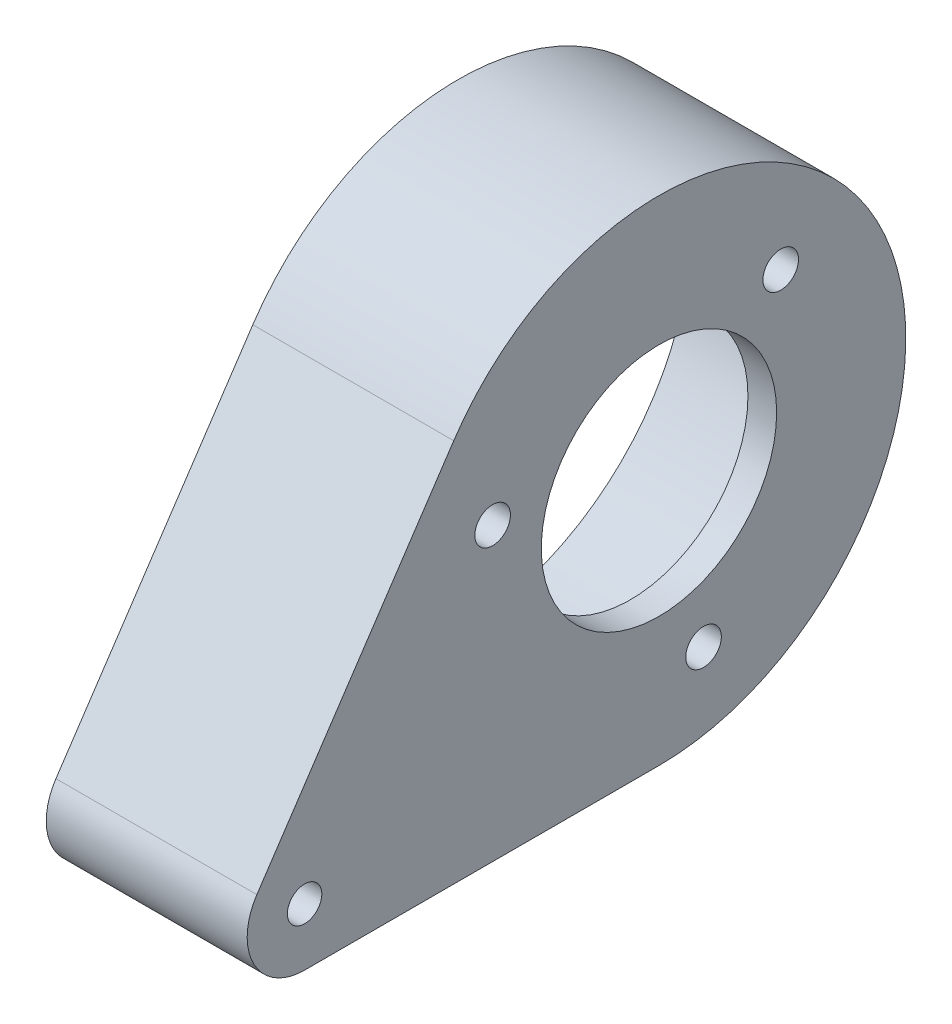
ISO-10303-21;
HEADER;
FILE_DESCRIPTION(('STEP AP214'),'2;1');
FILE_NAME('part.step','',(''),(''),'','','');
FILE_SCHEMA(('AUTOMOTIVE_DESIGN { 1 0 10303 214 1 1 1 1 }'));
ENDSEC;
DATA;
#1=APPLICATION_CONTEXT('core data for automotive mechanical design processes');
#2=APPLICATION_PROTOCOL_DEFINITION('international standard','automotive_design',2000,#1);
#3=PRODUCT_CONTEXT('',#1,'mechanical');
#4=PRODUCT('Part','Part','',(#3));
#5=PRODUCT_RELATED_PRODUCT_CATEGORY('part','',(#4));
#6=PRODUCT_DEFINITION_FORMATION('','',#4);
#7=PRODUCT_DEFINITION_CONTEXT('part definition',#1,'design');
#8=PRODUCT_DEFINITION('design','',#6,#7);
#9=PRODUCT_DEFINITION_SHAPE('','',#8);
#10=(LENGTH_UNIT() NAMED_UNIT(*) SI_UNIT(.MILLI.,.METRE.));
#11=(NAMED_UNIT(*) PLANE_ANGLE_UNIT() SI_UNIT($,.RADIAN.));
#12=(NAMED_UNIT(*) SI_UNIT($,.STERADIAN.) SOLID_ANGLE_UNIT());
#13=UNCERTAINTY_MEASURE_WITH_UNIT(LENGTH_MEASURE(1.E-05),#10,'distance_accuracy_value','');
#14=(GEOMETRIC_REPRESENTATION_CONTEXT(3) GLOBAL_UNCERTAINTY_ASSIGNED_CONTEXT((#13)) GLOBAL_UNIT_ASSIGNED_CONTEXT((#10,
#11,#12)) REPRESENTATION_CONTEXT('',''));
#15=CARTESIAN_POINT('',(0.,0.,0.));
#16=DIRECTION('',(0.,0.,1.));
#17=DIRECTION('',(1.,0.,0.));
#18=AXIS2_PLACEMENT_3D('',#15,#16,#17);
#19=CARTESIAN_POINT('',(2.5,-16.5,30.8666486681013));
#20=DIRECTION('',(-1.,0.,0.));
#21=DIRECTION('',(0.,0.,1.));
#22=AXIS2_PLACEMENT_3D('',#19,#20,#21);
#23=CYLINDRICAL_SURFACE('',#22,5.);
#24=DIRECTION('',(-1.,0.,0.));
#25=VECTOR('',#24,1.);
#26=CARTESIAN_POINT('',(2.5,-13.7224489795918,35.0241972642129));
#27=LINE('',#26,#25);
#28=CARTESIAN_POINT('',(2.5,-13.7224489795918,35.0241972642129));
#29=VERTEX_POINT('',#28);
#30=CARTESIAN_POINT('',(-15.,-13.7224489795918,35.0241972642129));
#31=VERTEX_POINT('',#30);
#32=EDGE_CURVE('E189',#29,#31,#27,.T.);
#33=ORIENTED_EDGE('',*,*,#32,.T.);
#34=CARTESIAN_POINT('',(-15.,-16.5,30.8666486681013));
#35=DIRECTION('',(-1.,0.,0.));
#36=DIRECTION('',(0.,0.,1.));
#37=AXIS2_PLACEMENT_3D('',#34,#35,#36);
#38=CIRCLE('',#37,5.);
#39=CARTESIAN_POINT('',(-15.,-21.5,30.8666486681013));
#40=VERTEX_POINT('',#39);
#41=EDGE_CURVE('E176',#40,#31,#38,.T.);
#42=ORIENTED_EDGE('',*,*,#41,.F.);
#43=DIRECTION('',(-1.,0.,0.));
#44=VECTOR('',#43,1.);
#45=CARTESIAN_POINT('',(2.5,-21.5,30.8666486681013));
#46=LINE('',#45,#44);
#47=CARTESIAN_POINT('',(2.5,-21.5,30.8666486681013));
#48=VERTEX_POINT('',#47);
#49=EDGE_CURVE('E47',#48,#40,#46,.T.);
#50=ORIENTED_EDGE('',*,*,#49,.F.);
#51=CARTESIAN_POINT('',(2.5,-16.5,30.8666486681013));
#52=DIRECTION('',(1.,0.,0.));
#53=DIRECTION('',(0.,0.,-1.));
#54=AXIS2_PLACEMENT_3D('',#51,#52,#53);
#55=CIRCLE('',#54,5.);
#56=EDGE_CURVE('E182',#29,#48,#55,.T.);
#57=ORIENTED_EDGE('',*,*,#56,.F.);
#58=EDGE_LOOP('',(#33,#42,#50,#57));
#59=FACE_BOUND('',#58,.T.);
#60=ADVANCED_FACE('F40',(#59),#23,.T.);
#61=CARTESIAN_POINT('',(2.5,-21.5,30.8666486681013));
#62=DIRECTION('',(0.,1.,0.));
#63=DIRECTION('',(0.,0.,1.));
#64=AXIS2_PLACEMENT_3D('',#61,#62,#63);
#65=PLANE('',#64);
#66=ORIENTED_EDGE('',*,*,#49,.T.);
#67=DIRECTION('',(0.,0.,1.));
#68=VECTOR('',#67,1.);
#69=CARTESIAN_POINT('',(-15.,-21.5,0.));
#70=LINE('',#69,#68);
#71=CARTESIAN_POINT('',(-15.,-21.5,0.));
#72=VERTEX_POINT('',#71);
#73=EDGE_CURVE('E173',#72,#40,#70,.T.);
#74=ORIENTED_EDGE('',*,*,#73,.F.);
#75=DIRECTION('',(-1.,0.,0.));
#76=VECTOR('',#75,1.);
#77=CARTESIAN_POINT('',(2.5,-21.5,0.));
#78=LINE('',#77,#76);
#79=CARTESIAN_POINT('',(2.5,-21.5,0.));
#80=VERTEX_POINT('',#79);
#81=EDGE_CURVE('E193',#80,#72,#78,.T.);
#82=ORIENTED_EDGE('',*,*,#81,.F.);
#83=DIRECTION('',(0.,0.,-1.));
#84=VECTOR('',#83,1.);
#85=CARTESIAN_POINT('',(2.5,-21.5,30.8666486681013));
#86=LINE('',#85,#84);
#87=EDGE_CURVE('E184',#48,#80,#86,.T.);
#88=ORIENTED_EDGE('',*,*,#87,.F.);
#89=EDGE_LOOP('',(#66,#74,#82,#88));
#90=FACE_BOUND('',#89,.T.);
#91=ADVANCED_FACE('F197',(#90),#65,.F.);
#92=CARTESIAN_POINT('',(2.5,0.,0.));
#93=DIRECTION('',(-1.,0.,0.));
#94=DIRECTION('',(0.,0.,1.));
#95=AXIS2_PLACEMENT_3D('',#92,#93,#94);
#96=CYLINDRICAL_SURFACE('',#95,21.5);
#97=ORIENTED_EDGE('',*,*,#81,.T.);
#98=CARTESIAN_POINT('',(-15.,0.,0.));
#99=DIRECTION('',(-1.,0.,0.));
#100=DIRECTION('',(0.,0.,1.));
#101=AXIS2_PLACEMENT_3D('',#98,#99,#100);
#102=CIRCLE('',#101,21.5);
#103=CARTESIAN_POINT('',(-15.,11.9434693877551,17.8774589632799));
#104=VERTEX_POINT('',#103);
#105=EDGE_CURVE('E168',#104,#72,#102,.T.);
#106=ORIENTED_EDGE('',*,*,#105,.F.);
#107=DIRECTION('',(-1.,0.,0.));
#108=VECTOR('',#107,1.);
#109=CARTESIAN_POINT('',(2.5,11.9434693877551,17.8774589632799));
#110=LINE('',#109,#108);
#111=CARTESIAN_POINT('',(2.5,11.9434693877551,17.8774589632799));
#112=VERTEX_POINT('',#111);
#113=EDGE_CURVE('E191',#112,#104,#110,.T.);
#114=ORIENTED_EDGE('',*,*,#113,.F.);
#115=CARTESIAN_POINT('',(2.5,0.,0.));
#116=DIRECTION('',(1.,0.,0.));
#117=DIRECTION('',(0.,0.,-1.));
#118=AXIS2_PLACEMENT_3D('',#115,#116,#117);
#119=CIRCLE('',#118,21.5);
#120=EDGE_CURVE('E186',#80,#112,#119,.T.);
#121=ORIENTED_EDGE('',*,*,#120,.F.);
#122=EDGE_LOOP('',(#97,#106,#114,#121));
#123=FACE_BOUND('',#122,.T.);
#124=ADVANCED_FACE('F210',(#123),#96,.T.);
#125=CARTESIAN_POINT('',(2.5,-13.7224489795918,35.0241972642129));
#126=DIRECTION('',(0.,-0.555510204081633,-0.831509719222321));
#127=DIRECTION('',(0.,0.831509719222321,-0.555510204081633));
#128=AXIS2_PLACEMENT_3D('',#125,#126,#127);
#129=PLANE('',#128);
#130=ORIENTED_EDGE('',*,*,#113,.T.);
#131=DIRECTION('',(0.,0.831509719222321,-0.555510204081633));
#132=VECTOR('',#131,1.);
#133=CARTESIAN_POINT('',(-15.,11.9434693877551,17.8774589632799));
#134=LINE('',#133,#132);
#135=EDGE_CURVE('E179',#31,#104,#134,.T.);
#136=ORIENTED_EDGE('',*,*,#135,.F.);
#137=ORIENTED_EDGE('',*,*,#32,.F.);
#138=DIRECTION('',(0.,-0.831509719222321,0.555510204081633));
#139=VECTOR('',#138,1.);
#140=CARTESIAN_POINT('',(2.5,-13.7224489795918,35.0241972642129));
#141=LINE('',#140,#139);
#142=EDGE_CURVE('E61',#112,#29,#141,.T.);
#143=ORIENTED_EDGE('',*,*,#142,.F.);
#144=EDGE_LOOP('',(#130,#136,#137,#143));
#145=FACE_BOUND('',#144,.T.);
#146=ADVANCED_FACE('F207',(#145),#129,.F.);
#147=CARTESIAN_POINT('',(2.5,-16.5,30.8666486681013));
#148=DIRECTION('',(1.,0.,0.));
#149=DIRECTION('',(0.,0.,-1.));
#150=AXIS2_PLACEMENT_3D('',#147,#148,#149);
#151=PLANE('',#150);
#152=CARTESIAN_POINT('',(2.5,-16.5,30.8666486681013));
#153=DIRECTION('',(-1.,0.,0.));
#154=DIRECTION('',(0.,0.,1.));
#155=AXIS2_PLACEMENT_3D('',#152,#153,#154);
#156=CIRCLE('',#155,1.50000000000001);
#157=CARTESIAN_POINT('',(2.5,-16.5,32.3666486681013));
#158=VERTEX_POINT('',#157);
#159=EDGE_CURVE('E137',#158,#158,#156,.T.);
#160=ORIENTED_EDGE('',*,*,#159,.T.);
#161=EDGE_LOOP('',(#160));
#162=FACE_BOUND('',#161,.T.);
#163=CARTESIAN_POINT('',(2.5,3.88228567653788,14.488887394336));
#164=DIRECTION('',(1.,0.,0.));
#165=DIRECTION('',(0.,0.,-1.));
#166=AXIS2_PLACEMENT_3D('',#163,#164,#165);
#167=CIRCLE('',#166,1.55);
#168=CARTESIAN_POINT('',(2.5,3.88228567653788,12.938887394336));
#169=VERTEX_POINT('',#168);
#170=EDGE_CURVE('E140',#169,#169,#167,.T.);
#171=ORIENTED_EDGE('',*,*,#170,.F.);
#172=EDGE_LOOP('',(#171));
#173=FACE_BOUND('',#172,.T.);
#174=CARTESIAN_POINT('',(2.5,-14.488887394336,-3.88228567653773));
#175=DIRECTION('',(1.,0.,0.));
#176=DIRECTION('',(0.,0.,-1.));
#177=AXIS2_PLACEMENT_3D('',#174,#175,#176);
#178=CIRCLE('',#177,1.55);
#179=CARTESIAN_POINT('',(2.5,-14.488887394336,-5.43228567653774));
#180=VERTEX_POINT('',#179);
#181=EDGE_CURVE('E148',#180,#180,#178,.T.);
#182=ORIENTED_EDGE('',*,*,#181,.F.);
#183=EDGE_LOOP('',(#182));
#184=FACE_BOUND('',#183,.T.);
#185=CARTESIAN_POINT('',(2.5,0.,0.));
#186=DIRECTION('',(1.,0.,0.));
#187=DIRECTION('',(0.,0.,-1.));
#188=AXIS2_PLACEMENT_3D('',#185,#186,#187);
#189=CIRCLE('',#188,10.25);
#190=CARTESIAN_POINT('',(2.5,0.,-10.25));
#191=VERTEX_POINT('',#190);
#192=EDGE_CURVE('E154',#191,#191,#189,.T.);
#193=ORIENTED_EDGE('',*,*,#192,.F.);
#194=EDGE_LOOP('',(#193));
#195=FACE_BOUND('',#194,.T.);
#196=CARTESIAN_POINT('',(2.5,10.6066017177982,-10.6066017177983));
#197=DIRECTION('',(1.,0.,0.));
#198=DIRECTION('',(0.,0.,-1.));
#199=AXIS2_PLACEMENT_3D('',#196,#197,#198);
#200=CIRCLE('',#199,1.55);
#201=CARTESIAN_POINT('',(2.5,10.6066017177982,-12.1566017177983));
#202=VERTEX_POINT('',#201);
#203=EDGE_CURVE('E160',#202,#202,#200,.T.);
#204=ORIENTED_EDGE('',*,*,#203,.F.);
#205=EDGE_LOOP('',(#204));
#206=FACE_BOUND('',#205,.T.);
#207=ORIENTED_EDGE('',*,*,#56,.T.);
#208=ORIENTED_EDGE('',*,*,#87,.T.);
#209=ORIENTED_EDGE('',*,*,#120,.T.);
#210=ORIENTED_EDGE('',*,*,#142,.T.);
#211=EDGE_LOOP('',(#207,#208,#209,#210));
#212=FACE_BOUND('',#211,.T.);
#213=ADVANCED_FACE('F212',(#162,#173,#184,#195,#206,#212),#151,.T.);
#214=CARTESIAN_POINT('',(-15.,0.,0.));
#215=DIRECTION('',(-1.,0.,0.));
#216=DIRECTION('',(0.,0.,1.));
#217=AXIS2_PLACEMENT_3D('',#214,#215,#216);
#218=PLANE('',#217);
#219=DIRECTION('',(0.,0.,-1.));
#220=VECTOR('',#219,1.);
#221=CARTESIAN_POINT('',(-15.,4.5,20.25));
#222=LINE('',#221,#220);
#223=CARTESIAN_POINT('',(-15.,4.5,21.25));
#224=VERTEX_POINT('',#223);
#225=CARTESIAN_POINT('',(-15.,4.5,19.7436698716323));
#226=VERTEX_POINT('',#225);
#227=EDGE_CURVE('E110',#224,#226,#222,.T.);
#228=ORIENTED_EDGE('',*,*,#227,.F.);
#229=DIRECTION('',(0.,1.,0.));
#230=VECTOR('',#229,1.);
#231=CARTESIAN_POINT('',(-15.,4.5,21.25));
#232=LINE('',#231,#230);
#233=CARTESIAN_POINT('',(-15.,-4.5,21.25));
#234=VERTEX_POINT('',#233);
#235=EDGE_CURVE('E292',#234,#224,#232,.T.);
#236=ORIENTED_EDGE('',*,*,#235,.F.);
#237=DIRECTION('',(0.,0.,1.));
#238=VECTOR('',#237,1.);
#239=CARTESIAN_POINT('',(-15.,-4.5,21.25));
#240=LINE('',#239,#238);
#241=CARTESIAN_POINT('',(-15.,-4.5,19.7436698716323));
#242=VERTEX_POINT('',#241);
#243=EDGE_CURVE('E122',#242,#234,#240,.T.);
#244=ORIENTED_EDGE('',*,*,#243,.F.);
#245=CARTESIAN_POINT('',(-15.,0.,0.));
#246=DIRECTION('',(-1.,0.,0.));
#247=DIRECTION('',(0.,0.,1.));
#248=AXIS2_PLACEMENT_3D('',#245,#246,#247);
#249=CIRCLE('',#248,20.25);
#250=EDGE_CURVE('E126',#226,#242,#249,.T.);
#251=ORIENTED_EDGE('',*,*,#250,.F.);
#252=EDGE_LOOP('',(#228,#236,#244,#251));
#253=FACE_BOUND('',#252,.T.);
#254=CARTESIAN_POINT('',(-15.,-16.5,30.8666486681013));
#255=DIRECTION('',(-1.,0.,0.));
#256=DIRECTION('',(0.,0.,1.));
#257=AXIS2_PLACEMENT_3D('',#254,#255,#256);
#258=CIRCLE('',#257,1.50000000000001);
#259=CARTESIAN_POINT('',(-15.,-16.5,32.3666486681013));
#260=VERTEX_POINT('',#259);
#261=EDGE_CURVE('E136',#260,#260,#258,.T.);
#262=ORIENTED_EDGE('',*,*,#261,.F.);
#263=EDGE_LOOP('',(#262));
#264=FACE_BOUND('',#263,.T.);
#265=ORIENTED_EDGE('',*,*,#105,.T.);
#266=ORIENTED_EDGE('',*,*,#73,.T.);
#267=ORIENTED_EDGE('',*,*,#41,.T.);
#268=ORIENTED_EDGE('',*,*,#135,.T.);
#269=EDGE_LOOP('',(#265,#266,#267,#268));
#270=FACE_BOUND('',#269,.T.);
#271=ADVANCED_FACE('F203',(#253,#264,#270),#218,.T.);
#272=CARTESIAN_POINT('',(-15.,0.,0.));
#273=DIRECTION('',(1.,0.,0.));
#274=DIRECTION('',(0.,0.,-1.));
#275=AXIS2_PLACEMENT_3D('',#272,#273,#274);
#276=CYLINDRICAL_SURFACE('',#275,20.25);
#277=DIRECTION('',(-1.,0.,0.));
#278=VECTOR('',#277,1.);
#279=CARTESIAN_POINT('',(9.12518659840052,4.5,19.7436698716323));
#280=LINE('',#279,#278);
#281=CARTESIAN_POINT('',(-4.,4.5,19.7436698716323));
#282=VERTEX_POINT('',#281);
#283=EDGE_CURVE('E104',#282,#226,#280,.T.);
#284=ORIENTED_EDGE('',*,*,#283,.T.);
#285=ORIENTED_EDGE('',*,*,#250,.T.);
#286=DIRECTION('',(-1.,0.,0.));
#287=VECTOR('',#286,1.);
#288=CARTESIAN_POINT('',(9.12518659840052,-4.5,19.7436698716323));
#289=LINE('',#288,#287);
#290=CARTESIAN_POINT('',(-4.,-4.5,19.7436698716323));
#291=VERTEX_POINT('',#290);
#292=EDGE_CURVE('E115',#291,#242,#289,.T.);
#293=ORIENTED_EDGE('',*,*,#292,.F.);
#294=CARTESIAN_POINT('',(-4.,0.,0.));
#295=DIRECTION('',(1.,0.,0.));
#296=DIRECTION('',(0.,0.,-1.));
#297=AXIS2_PLACEMENT_3D('',#294,#295,#296);
#298=CIRCLE('',#297,20.25);
#299=EDGE_CURVE('E13',#282,#291,#298,.T.);
#300=ORIENTED_EDGE('',*,*,#299,.F.);
#301=EDGE_LOOP('',(#284,#285,#293,#300));
#302=FACE_BOUND('',#301,.T.);
#303=CARTESIAN_POINT('',(0.,0.,0.));
#304=DIRECTION('',(-1.,0.,0.));
#305=DIRECTION('',(0.,0.,1.));
#306=AXIS2_PLACEMENT_3D('',#303,#304,#305);
#307=CIRCLE('',#306,20.25);
#308=CARTESIAN_POINT('',(0.,0.,20.25));
#309=VERTEX_POINT('',#308);
#310=EDGE_CURVE('E166',#309,#309,#307,.T.);
#311=ORIENTED_EDGE('',*,*,#310,.F.);
#312=EDGE_LOOP('',(#311));
#313=FACE_BOUND('',#312,.T.);
#314=ADVANCED_FACE('F124',(#302,#313),#276,.F.);
#315=CARTESIAN_POINT('',(0.,-16.5,30.8666486681013));
#316=DIRECTION('',(1.,0.,0.));
#317=DIRECTION('',(0.,0.,-1.));
#318=AXIS2_PLACEMENT_3D('',#315,#316,#317);
#319=PLANE('',#318);
#320=CARTESIAN_POINT('',(0.,3.88228567653788,14.488887394336));
#321=DIRECTION('',(1.,0.,0.));
#322=DIRECTION('',(0.,0.,-1.));
#323=AXIS2_PLACEMENT_3D('',#320,#321,#322);
#324=CIRCLE('',#323,1.55);
#325=CARTESIAN_POINT('',(0.,3.88228567653788,12.938887394336));
#326=VERTEX_POINT('',#325);
#327=EDGE_CURVE('E145',#326,#326,#324,.F.);
#328=ORIENTED_EDGE('',*,*,#327,.F.);
#329=EDGE_LOOP('',(#328));
#330=FACE_BOUND('',#329,.T.);
#331=CARTESIAN_POINT('',(0.,-14.488887394336,-3.88228567653773));
#332=DIRECTION('',(1.,0.,0.));
#333=DIRECTION('',(0.,0.,-1.));
#334=AXIS2_PLACEMENT_3D('',#331,#332,#333);
#335=CIRCLE('',#334,1.55);
#336=CARTESIAN_POINT('',(0.,-14.488887394336,-5.43228567653774));
#337=VERTEX_POINT('',#336);
#338=EDGE_CURVE('E151',#337,#337,#335,.F.);
#339=ORIENTED_EDGE('',*,*,#338,.F.);
#340=EDGE_LOOP('',(#339));
#341=FACE_BOUND('',#340,.T.);
#342=CARTESIAN_POINT('',(0.,0.,0.));
#343=DIRECTION('',(1.,0.,0.));
#344=DIRECTION('',(0.,0.,-1.));
#345=AXIS2_PLACEMENT_3D('',#342,#343,#344);
#346=CIRCLE('',#345,10.25);
#347=CARTESIAN_POINT('',(0.,0.,-10.25));
#348=VERTEX_POINT('',#347);
#349=EDGE_CURVE('E157',#348,#348,#346,.F.);
#350=ORIENTED_EDGE('',*,*,#349,.F.);
#351=EDGE_LOOP('',(#350));
#352=FACE_BOUND('',#351,.T.);
#353=CARTESIAN_POINT('',(0.,10.6066017177982,-10.6066017177983));
#354=DIRECTION('',(1.,0.,0.));
#355=DIRECTION('',(0.,0.,-1.));
#356=AXIS2_PLACEMENT_3D('',#353,#354,#355);
#357=CIRCLE('',#356,1.55);
#358=CARTESIAN_POINT('',(0.,10.6066017177982,-12.1566017177983));
#359=VERTEX_POINT('',#358);
#360=EDGE_CURVE('E163',#359,#359,#357,.F.);
#361=ORIENTED_EDGE('',*,*,#360,.F.);
#362=EDGE_LOOP('',(#361));
#363=FACE_BOUND('',#362,.T.);
#364=ORIENTED_EDGE('',*,*,#310,.T.);
#365=EDGE_LOOP('',(#364));
#366=FACE_BOUND('',#365,.T.);
#367=ADVANCED_FACE('F233',(#330,#341,#352,#363,#366),#319,.F.);
#368=CARTESIAN_POINT('',(-28.9913780286484,10.6066017177982,-10.6066017177983));
#369=DIRECTION('',(1.,0.,0.));
#370=DIRECTION('',(0.,0.,-1.));
#371=AXIS2_PLACEMENT_3D('',#368,#369,#370);
#372=CYLINDRICAL_SURFACE('',#371,1.55);
#373=ORIENTED_EDGE('',*,*,#360,.T.);
#374=EDGE_LOOP('',(#373));
#375=FACE_BOUND('',#374,.T.);
#376=ORIENTED_EDGE('',*,*,#203,.T.);
#377=EDGE_LOOP('',(#376));
#378=FACE_BOUND('',#377,.T.);
#379=ADVANCED_FACE('F235',(#375,#378),#372,.F.);
#380=CARTESIAN_POINT('',(-28.9913780286484,0.,0.));
#381=DIRECTION('',(1.,0.,0.));
#382=DIRECTION('',(0.,0.,-1.));
#383=AXIS2_PLACEMENT_3D('',#380,#381,#382);
#384=CYLINDRICAL_SURFACE('',#383,10.25);
#385=ORIENTED_EDGE('',*,*,#349,.T.);
#386=EDGE_LOOP('',(#385));
#387=FACE_BOUND('',#386,.T.);
#388=ORIENTED_EDGE('',*,*,#192,.T.);
#389=EDGE_LOOP('',(#388));
#390=FACE_BOUND('',#389,.T.);
#391=ADVANCED_FACE('F241',(#387,#390),#384,.F.);
#392=CARTESIAN_POINT('',(-28.9913780286484,-14.488887394336,-3.88228567653773));
#393=DIRECTION('',(1.,0.,0.));
#394=DIRECTION('',(0.,0.,-1.));
#395=AXIS2_PLACEMENT_3D('',#392,#393,#394);
#396=CYLINDRICAL_SURFACE('',#395,1.55);
#397=ORIENTED_EDGE('',*,*,#338,.T.);
#398=EDGE_LOOP('',(#397));
#399=FACE_BOUND('',#398,.T.);
#400=ORIENTED_EDGE('',*,*,#181,.T.);
#401=EDGE_LOOP('',(#400));
#402=FACE_BOUND('',#401,.T.);
#403=ADVANCED_FACE('F260',(#399,#402),#396,.F.);
#404=CARTESIAN_POINT('',(-28.9913780286484,3.88228567653788,14.488887394336));
#405=DIRECTION('',(1.,0.,0.));
#406=DIRECTION('',(0.,0.,-1.));
#407=AXIS2_PLACEMENT_3D('',#404,#405,#406);
#408=CYLINDRICAL_SURFACE('',#407,1.55);
#409=ORIENTED_EDGE('',*,*,#327,.T.);
#410=EDGE_LOOP('',(#409));
#411=FACE_BOUND('',#410,.T.);
#412=ORIENTED_EDGE('',*,*,#170,.T.);
#413=EDGE_LOOP('',(#412));
#414=FACE_BOUND('',#413,.T.);
#415=ADVANCED_FACE('F267',(#411,#414),#408,.F.);
#416=CARTESIAN_POINT('',(2.5,-16.5,30.8666486681013));
#417=DIRECTION('',(-1.,0.,0.));
#418=DIRECTION('',(0.,0.,1.));
#419=AXIS2_PLACEMENT_3D('',#416,#417,#418);
#420=CYLINDRICAL_SURFACE('',#419,1.50000000000001);
#421=ORIENTED_EDGE('',*,*,#159,.F.);
#422=EDGE_LOOP('',(#421));
#423=FACE_BOUND('',#422,.T.);
#424=ORIENTED_EDGE('',*,*,#261,.T.);
#425=EDGE_LOOP('',(#424));
#426=FACE_BOUND('',#425,.T.);
#427=ADVANCED_FACE('F273',(#423,#426),#420,.F.);
#428=CARTESIAN_POINT('',(-4.,-16.5,30.8666486681013));
#429=DIRECTION('',(1.,0.,0.));
#430=DIRECTION('',(0.,0.,-1.));
#431=AXIS2_PLACEMENT_3D('',#428,#429,#430);
#432=PLANE('',#431);
#433=ORIENTED_EDGE('',*,*,#299,.T.);
#434=DIRECTION('',(0.,0.,1.));
#435=VECTOR('',#434,1.);
#436=CARTESIAN_POINT('',(-4.,-4.5,21.25));
#437=LINE('',#436,#435);
#438=CARTESIAN_POINT('',(-4.,-4.5,21.25));
#439=VERTEX_POINT('',#438);
#440=EDGE_CURVE('E54',#291,#439,#437,.T.);
#441=ORIENTED_EDGE('',*,*,#440,.T.);
#442=DIRECTION('',(0.,1.,0.));
#443=VECTOR('',#442,1.);
#444=CARTESIAN_POINT('',(-4.,4.5,21.25));
#445=LINE('',#444,#443);
#446=CARTESIAN_POINT('',(-4.,4.5,21.25));
#447=VERTEX_POINT('',#446);
#448=EDGE_CURVE('E120',#439,#447,#445,.T.);
#449=ORIENTED_EDGE('',*,*,#448,.T.);
#450=DIRECTION('',(0.,0.,-1.));
#451=VECTOR('',#450,1.);
#452=CARTESIAN_POINT('',(-4.,4.5,20.25));
#453=LINE('',#452,#451);
#454=EDGE_CURVE('E107',#447,#282,#453,.T.);
#455=ORIENTED_EDGE('',*,*,#454,.T.);
#456=EDGE_LOOP('',(#433,#441,#449,#455));
#457=FACE_BOUND('',#456,.T.);
#458=ADVANCED_FACE('F118',(#457),#432,.F.);
#459=CARTESIAN_POINT('',(9.12518659840052,4.5,20.25));
#460=DIRECTION('',(0.,1.,0.));
#461=DIRECTION('',(0.,0.,1.));
#462=AXIS2_PLACEMENT_3D('',#459,#460,#461);
#463=PLANE('',#462);
#464=DIRECTION('',(-1.,0.,0.));
#465=VECTOR('',#464,1.);
#466=CARTESIAN_POINT('',(9.12518659840052,4.5,21.25));
#467=LINE('',#466,#465);
#468=EDGE_CURVE('E134',#447,#224,#467,.T.);
#469=ORIENTED_EDGE('',*,*,#468,.T.);
#470=ORIENTED_EDGE('',*,*,#227,.T.);
#471=ORIENTED_EDGE('',*,*,#283,.F.);
#472=ORIENTED_EDGE('',*,*,#454,.F.);
#473=EDGE_LOOP('',(#469,#470,#471,#472));
#474=FACE_BOUND('',#473,.T.);
#475=ADVANCED_FACE('F106',(#474),#463,.F.);
#476=CARTESIAN_POINT('',(9.12518659840052,-4.5,21.25));
#477=DIRECTION('',(0.,-1.,0.));
#478=DIRECTION('',(0.,0.,-1.));
#479=AXIS2_PLACEMENT_3D('',#476,#477,#478);
#480=PLANE('',#479);
#481=ORIENTED_EDGE('',*,*,#292,.T.);
#482=ORIENTED_EDGE('',*,*,#243,.T.);
#483=DIRECTION('',(-1.,0.,0.));
#484=VECTOR('',#483,1.);
#485=CARTESIAN_POINT('',(9.12518659840052,-4.5,21.25));
#486=LINE('',#485,#484);
#487=EDGE_CURVE('E130',#439,#234,#486,.T.);
#488=ORIENTED_EDGE('',*,*,#487,.F.);
#489=ORIENTED_EDGE('',*,*,#440,.F.);
#490=EDGE_LOOP('',(#481,#482,#488,#489));
#491=FACE_BOUND('',#490,.T.);
#492=ADVANCED_FACE('F282',(#491),#480,.F.);
#493=CARTESIAN_POINT('',(9.12518659840052,4.5,21.25));
#494=DIRECTION('',(0.,0.,1.));
#495=DIRECTION('',(1.,0.,0.));
#496=AXIS2_PLACEMENT_3D('',#493,#494,#495);
#497=PLANE('',#496);
#498=ORIENTED_EDGE('',*,*,#487,.T.);
#499=ORIENTED_EDGE('',*,*,#235,.T.);
#500=ORIENTED_EDGE('',*,*,#468,.F.);
#501=ORIENTED_EDGE('',*,*,#448,.F.);
#502=EDGE_LOOP('',(#498,#499,#500,#501));
#503=FACE_BOUND('',#502,.T.);
#504=ADVANCED_FACE('F285',(#503),#497,.F.);
#505=CLOSED_SHELL('',(#60,#91,#124,#146,#213,#271,#314,#367,#379,#391,#403,#415,#427,#458,#475,
#492,#504));
#506=MANIFOLD_SOLID_BREP('B2',#505);
#507=ADVANCED_BREP_SHAPE_REPRESENTATION('',(#18,#506),#14);
#508=SHAPE_DEFINITION_REPRESENTATION(#9,#507);
ENDSEC;
END-ISO-10303-21;
